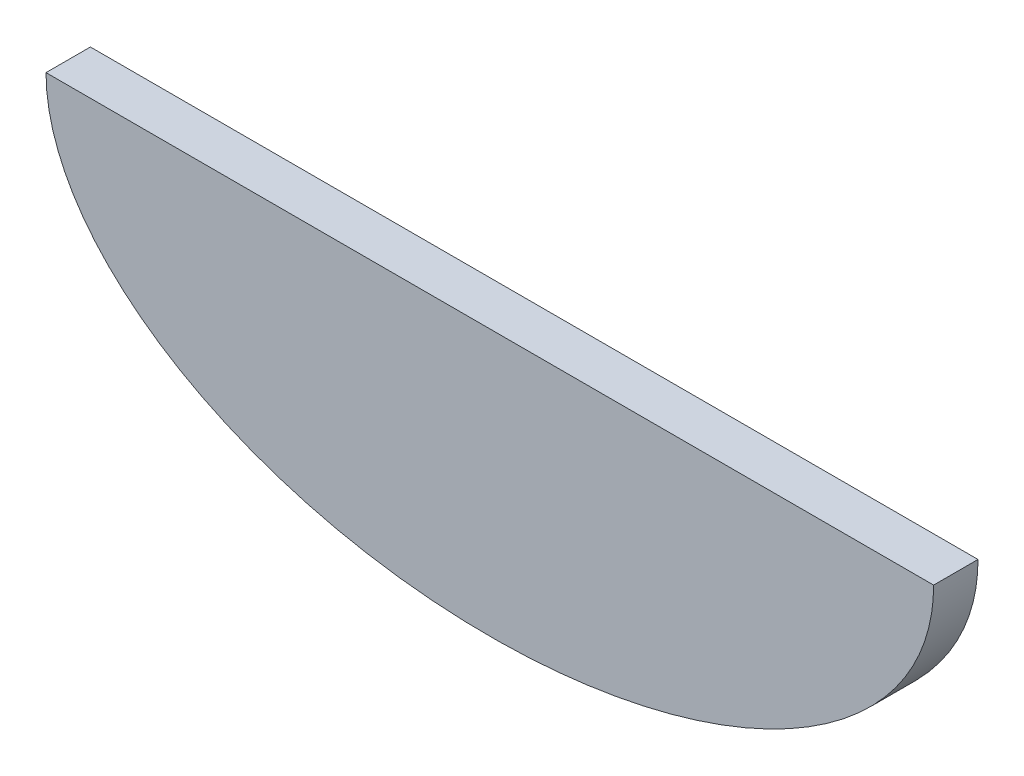
ISO-10303-21;
HEADER;
FILE_DESCRIPTION(('STEP AP214'),'2;1');
FILE_NAME('part.step','',(''),(''),'','','');
FILE_SCHEMA(('AUTOMOTIVE_DESIGN { 1 0 10303 214 1 1 1 1 }'));
ENDSEC;
DATA;
#1=APPLICATION_CONTEXT('core data for automotive mechanical design processes');
#2=APPLICATION_PROTOCOL_DEFINITION('international standard','automotive_design',2000,#1);
#3=PRODUCT_CONTEXT('',#1,'mechanical');
#4=PRODUCT('Part','Part','',(#3));
#5=PRODUCT_RELATED_PRODUCT_CATEGORY('part','',(#4));
#6=PRODUCT_DEFINITION_FORMATION('','',#4);
#7=PRODUCT_DEFINITION_CONTEXT('part definition',#1,'design');
#8=PRODUCT_DEFINITION('design','',#6,#7);
#9=PRODUCT_DEFINITION_SHAPE('','',#8);
#10=(LENGTH_UNIT() NAMED_UNIT(*) SI_UNIT(.MILLI.,.METRE.));
#11=(NAMED_UNIT(*) PLANE_ANGLE_UNIT() SI_UNIT($,.RADIAN.));
#12=(NAMED_UNIT(*) SI_UNIT($,.STERADIAN.) SOLID_ANGLE_UNIT());
#13=UNCERTAINTY_MEASURE_WITH_UNIT(LENGTH_MEASURE(1.E-05),#10,'distance_accuracy_value','');
#14=(GEOMETRIC_REPRESENTATION_CONTEXT(3) GLOBAL_UNCERTAINTY_ASSIGNED_CONTEXT((#13)) GLOBAL_UNIT_ASSIGNED_CONTEXT((#10,
#11,#12)) REPRESENTATION_CONTEXT('',''));
#15=CARTESIAN_POINT('',(0.,0.,0.));
#16=DIRECTION('',(0.,0.,1.));
#17=DIRECTION('',(1.,0.,0.));
#18=AXIS2_PLACEMENT_3D('',#15,#16,#17);
#19=CARTESIAN_POINT('',(0.,0.,2.));
#20=DIRECTION('',(0.,0.,1.));
#21=DIRECTION('',(1.,0.,0.));
#22=AXIS2_PLACEMENT_3D('',#19,#20,#21);
#23=ELLIPSE('',#22,20.,12.);
#24=DIRECTION('',(0.,0.,-1.));
#25=VECTOR('',#24,1.);
#26=SURFACE_OF_LINEAR_EXTRUSION('',#23,#25);
#27=CARTESIAN_POINT('',(0.,0.,0.));
#28=DIRECTION('',(0.,0.,1.));
#29=DIRECTION('',(1.,0.,0.));
#30=AXIS2_PLACEMENT_3D('',#27,#28,#29);
#31=ELLIPSE('',#30,20.,12.);
#32=CARTESIAN_POINT('',(-20.,0.,0.));
#33=VERTEX_POINT('',#32);
#34=CARTESIAN_POINT('',(20.,0.,0.));
#35=VERTEX_POINT('',#34);
#36=EDGE_CURVE('E81',#33,#35,#31,.T.);
#37=ORIENTED_EDGE('',*,*,#36,.T.);
#38=DIRECTION('',(0.,0.,-1.));
#39=VECTOR('',#38,1.);
#40=CARTESIAN_POINT('',(20.,0.,2.));
#41=LINE('',#40,#39);
#42=CARTESIAN_POINT('',(20.,0.,2.));
#43=VERTEX_POINT('',#42);
#44=EDGE_CURVE('E11',#43,#35,#41,.T.);
#45=ORIENTED_EDGE('',*,*,#44,.F.);
#46=CARTESIAN_POINT('',(-20.,0.,2.));
#47=VERTEX_POINT('',#46);
#48=EDGE_CURVE('E80',#47,#43,#23,.T.);
#49=ORIENTED_EDGE('',*,*,#48,.F.);
#50=DIRECTION('',(0.,0.,-1.));
#51=VECTOR('',#50,1.);
#52=CARTESIAN_POINT('',(-20.,0.,2.));
#53=LINE('',#52,#51);
#54=EDGE_CURVE('E57',#47,#33,#53,.T.);
#55=ORIENTED_EDGE('',*,*,#54,.T.);
#56=EDGE_LOOP('',(#37,#45,#49,#55));
#57=FACE_BOUND('',#56,.T.);
#58=ADVANCED_FACE('F47',(#57),#26,.F.);
#59=CARTESIAN_POINT('',(-20.,0.,2.));
#60=DIRECTION('',(0.,-1.,0.));
#61=DIRECTION('',(1.,0.,0.));
#62=AXIS2_PLACEMENT_3D('',#59,#60,#61);
#63=PLANE('',#62);
#64=DIRECTION('',(-1.,0.,0.));
#65=VECTOR('',#64,1.);
#66=CARTESIAN_POINT('',(-20.,0.,0.));
#67=LINE('',#66,#65);
#68=EDGE_CURVE('E72',#35,#33,#67,.T.);
#69=ORIENTED_EDGE('',*,*,#68,.T.);
#70=ORIENTED_EDGE('',*,*,#54,.F.);
#71=DIRECTION('',(-1.,0.,0.));
#72=VECTOR('',#71,1.);
#73=CARTESIAN_POINT('',(-20.,0.,2.));
#74=LINE('',#73,#72);
#75=EDGE_CURVE('E64',#43,#47,#74,.T.);
#76=ORIENTED_EDGE('',*,*,#75,.F.);
#77=ORIENTED_EDGE('',*,*,#44,.T.);
#78=EDGE_LOOP('',(#69,#70,#76,#77));
#79=FACE_BOUND('',#78,.T.);
#80=ADVANCED_FACE('F75',(#79),#63,.F.);
#81=CARTESIAN_POINT('',(0.,0.,2.));
#82=DIRECTION('',(0.,0.,1.));
#83=DIRECTION('',(1.,0.,0.));
#84=AXIS2_PLACEMENT_3D('',#81,#82,#83);
#85=PLANE('',#84);
#86=ORIENTED_EDGE('',*,*,#48,.T.);
#87=ORIENTED_EDGE('',*,*,#75,.T.);
#88=EDGE_LOOP('',(#86,#87));
#89=FACE_BOUND('',#88,.T.);
#90=ADVANCED_FACE('F92',(#89),#85,.T.);
#91=CARTESIAN_POINT('',(0.,0.,0.));
#92=DIRECTION('',(0.,0.,1.));
#93=DIRECTION('',(1.,0.,0.));
#94=AXIS2_PLACEMENT_3D('',#91,#92,#93);
#95=PLANE('',#94);
#96=ORIENTED_EDGE('',*,*,#36,.F.);
#97=ORIENTED_EDGE('',*,*,#68,.F.);
#98=EDGE_LOOP('',(#96,#97));
#99=FACE_BOUND('',#98,.T.);
#100=ADVANCED_FACE('F85',(#99),#95,.F.);
#101=CLOSED_SHELL('',(#58,#80,#90,#100));
#102=MANIFOLD_SOLID_BREP('B2',#101);
#103=ADVANCED_BREP_SHAPE_REPRESENTATION('',(#18,#102),#14);
#104=SHAPE_DEFINITION_REPRESENTATION(#9,#103);
ENDSEC;
END-ISO-10303-21;
